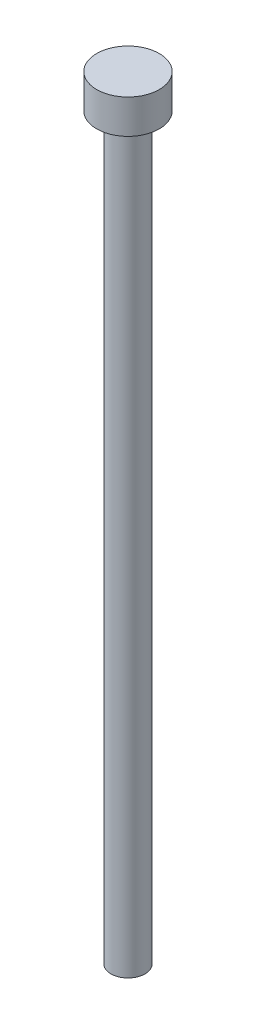
ISO-10303-21;
HEADER;
FILE_DESCRIPTION(('STEP AP214'),'2;1');
FILE_NAME('part.step','',(''),(''),'','','');
FILE_SCHEMA(('AUTOMOTIVE_DESIGN { 1 0 10303 214 1 1 1 1 }'));
ENDSEC;
DATA;
#1=APPLICATION_CONTEXT('core data for automotive mechanical design processes');
#2=APPLICATION_PROTOCOL_DEFINITION('international standard','automotive_design',2000,#1);
#3=PRODUCT_CONTEXT('',#1,'mechanical');
#4=PRODUCT('Part','Part','',(#3));
#5=PRODUCT_RELATED_PRODUCT_CATEGORY('part','',(#4));
#6=PRODUCT_DEFINITION_FORMATION('','',#4);
#7=PRODUCT_DEFINITION_CONTEXT('part definition',#1,'design');
#8=PRODUCT_DEFINITION('design','',#6,#7);
#9=PRODUCT_DEFINITION_SHAPE('','',#8);
#10=(LENGTH_UNIT() NAMED_UNIT(*) SI_UNIT(.MILLI.,.METRE.));
#11=(NAMED_UNIT(*) PLANE_ANGLE_UNIT() SI_UNIT($,.RADIAN.));
#12=(NAMED_UNIT(*) SI_UNIT($,.STERADIAN.) SOLID_ANGLE_UNIT());
#13=UNCERTAINTY_MEASURE_WITH_UNIT(LENGTH_MEASURE(1.E-05),#10,'distance_accuracy_value','');
#14=(GEOMETRIC_REPRESENTATION_CONTEXT(3) GLOBAL_UNCERTAINTY_ASSIGNED_CONTEXT((#13)) GLOBAL_UNIT_ASSIGNED_CONTEXT((#10,
#11,#12)) REPRESENTATION_CONTEXT('',''));
#15=CARTESIAN_POINT('',(0.,0.,0.));
#16=DIRECTION('',(0.,0.,1.));
#17=DIRECTION('',(1.,0.,0.));
#18=AXIS2_PLACEMENT_3D('',#15,#16,#17);
#19=CARTESIAN_POINT('',(0.,-130.,0.));
#20=DIRECTION('',(0.,1.,0.));
#21=DIRECTION('',(0.,0.,1.));
#22=AXIS2_PLACEMENT_3D('',#19,#20,#21);
#23=CYLINDRICAL_SURFACE('',#22,3.);
#24=CARTESIAN_POINT('',(0.,-130.,0.));
#25=DIRECTION('',(0.,1.,0.));
#26=DIRECTION('',(0.,0.,1.));
#27=AXIS2_PLACEMENT_3D('',#24,#25,#26);
#28=CIRCLE('',#27,3.);
#29=CARTESIAN_POINT('',(0.,-130.,3.));
#30=VERTEX_POINT('',#29);
#31=EDGE_CURVE('E10',#30,#30,#28,.T.);
#32=ORIENTED_EDGE('',*,*,#31,.T.);
#33=EDGE_LOOP('',(#32));
#34=FACE_BOUND('',#33,.T.);
#35=CARTESIAN_POINT('',(0.,0.,0.));
#36=DIRECTION('',(0.,1.,0.));
#37=DIRECTION('',(0.,0.,1.));
#38=AXIS2_PLACEMENT_3D('',#35,#36,#37);
#39=CIRCLE('',#38,3.);
#40=CARTESIAN_POINT('',(0.,0.,3.));
#41=VERTEX_POINT('',#40);
#42=EDGE_CURVE('E34',#41,#41,#39,.T.);
#43=ORIENTED_EDGE('',*,*,#42,.F.);
#44=EDGE_LOOP('',(#43));
#45=FACE_BOUND('',#44,.T.);
#46=ADVANCED_FACE('F31',(#34,#45),#23,.T.);
#47=CARTESIAN_POINT('',(0.,-130.,0.));
#48=DIRECTION('',(0.,1.,0.));
#49=DIRECTION('',(0.,0.,1.));
#50=AXIS2_PLACEMENT_3D('',#47,#48,#49);
#51=PLANE('',#50);
#52=ORIENTED_EDGE('',*,*,#31,.F.);
#53=EDGE_LOOP('',(#52));
#54=FACE_BOUND('',#53,.T.);
#55=ADVANCED_FACE('F54',(#54),#51,.F.);
#56=CARTESIAN_POINT('',(0.,6.,0.));
#57=DIRECTION('',(0.,-1.,0.));
#58=DIRECTION('',(0.,0.,-1.));
#59=AXIS2_PLACEMENT_3D('',#56,#57,#58);
#60=CYLINDRICAL_SURFACE('',#59,5.5);
#61=CARTESIAN_POINT('',(0.,6.,0.));
#62=DIRECTION('',(0.,1.,0.));
#63=DIRECTION('',(0.,0.,1.));
#64=AXIS2_PLACEMENT_3D('',#61,#62,#63);
#65=CIRCLE('',#64,5.5);
#66=CARTESIAN_POINT('',(0.,6.,5.5));
#67=VERTEX_POINT('',#66);
#68=EDGE_CURVE('E41',#67,#67,#65,.T.);
#69=ORIENTED_EDGE('',*,*,#68,.F.);
#70=EDGE_LOOP('',(#69));
#71=FACE_BOUND('',#70,.T.);
#72=CARTESIAN_POINT('',(0.,0.,0.));
#73=DIRECTION('',(0.,1.,0.));
#74=DIRECTION('',(0.,0.,1.));
#75=AXIS2_PLACEMENT_3D('',#72,#73,#74);
#76=CIRCLE('',#75,5.5);
#77=CARTESIAN_POINT('',(0.,0.,5.5));
#78=VERTEX_POINT('',#77);
#79=EDGE_CURVE('E43',#78,#78,#76,.T.);
#80=ORIENTED_EDGE('',*,*,#79,.T.);
#81=EDGE_LOOP('',(#80));
#82=FACE_BOUND('',#81,.T.);
#83=ADVANCED_FACE('F51',(#71,#82),#60,.T.);
#84=CARTESIAN_POINT('',(0.,6.,0.));
#85=DIRECTION('',(0.,1.,0.));
#86=DIRECTION('',(0.,0.,1.));
#87=AXIS2_PLACEMENT_3D('',#84,#85,#86);
#88=PLANE('',#87);
#89=ORIENTED_EDGE('',*,*,#68,.T.);
#90=EDGE_LOOP('',(#89));
#91=FACE_BOUND('',#90,.T.);
#92=ADVANCED_FACE('F49',(#91),#88,.T.);
#93=CARTESIAN_POINT('',(0.,0.,0.));
#94=DIRECTION('',(0.,1.,0.));
#95=DIRECTION('',(0.,0.,1.));
#96=AXIS2_PLACEMENT_3D('',#93,#94,#95);
#97=PLANE('',#96);
#98=ORIENTED_EDGE('',*,*,#42,.T.);
#99=EDGE_LOOP('',(#98));
#100=FACE_BOUND('',#99,.T.);
#101=ORIENTED_EDGE('',*,*,#79,.F.);
#102=EDGE_LOOP('',(#101));
#103=FACE_BOUND('',#102,.T.);
#104=ADVANCED_FACE('F58',(#100,#103),#97,.F.);
#105=CLOSED_SHELL('',(#46,#55,#83,#92,#104));
#106=MANIFOLD_SOLID_BREP('B2',#105);
#107=ADVANCED_BREP_SHAPE_REPRESENTATION('',(#18,#106),#14);
#108=SHAPE_DEFINITION_REPRESENTATION(#9,#107);
ENDSEC;
END-ISO-10303-21;
